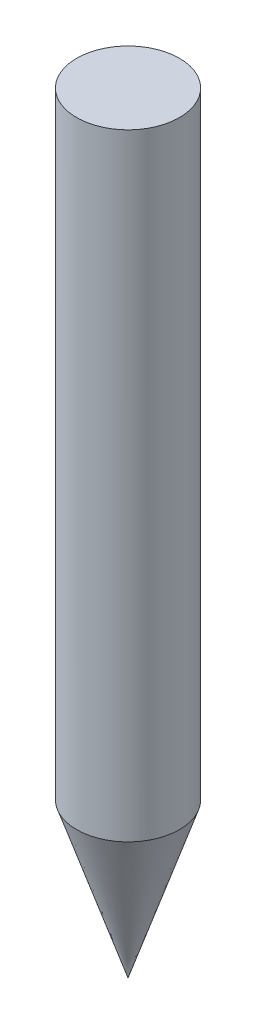
ISO-10303-21;
HEADER;
FILE_DESCRIPTION(('STEP AP214'),'2;1');
FILE_NAME('part.step','',(''),(''),'','','');
FILE_SCHEMA(('AUTOMOTIVE_DESIGN { 1 0 10303 214 1 1 1 1 }'));
ENDSEC;
DATA;
#1=APPLICATION_CONTEXT('core data for automotive mechanical design processes');
#2=APPLICATION_PROTOCOL_DEFINITION('international standard','automotive_design',2000,#1);
#3=PRODUCT_CONTEXT('',#1,'mechanical');
#4=PRODUCT('Part','Part','',(#3));
#5=PRODUCT_RELATED_PRODUCT_CATEGORY('part','',(#4));
#6=PRODUCT_DEFINITION_FORMATION('','',#4);
#7=PRODUCT_DEFINITION_CONTEXT('part definition',#1,'design');
#8=PRODUCT_DEFINITION('design','',#6,#7);
#9=PRODUCT_DEFINITION_SHAPE('','',#8);
#10=(LENGTH_UNIT() NAMED_UNIT(*) SI_UNIT(.MILLI.,.METRE.));
#11=(NAMED_UNIT(*) PLANE_ANGLE_UNIT() SI_UNIT($,.RADIAN.));
#12=(NAMED_UNIT(*) SI_UNIT($,.STERADIAN.) SOLID_ANGLE_UNIT());
#13=UNCERTAINTY_MEASURE_WITH_UNIT(LENGTH_MEASURE(1.E-05),#10,'distance_accuracy_value','');
#14=(GEOMETRIC_REPRESENTATION_CONTEXT(3) GLOBAL_UNCERTAINTY_ASSIGNED_CONTEXT((#13)) GLOBAL_UNIT_ASSIGNED_CONTEXT((#10,
#11,#12)) REPRESENTATION_CONTEXT('',''));
#15=CARTESIAN_POINT('',(0.,0.,0.));
#16=DIRECTION('',(0.,0.,1.));
#17=DIRECTION('',(1.,0.,0.));
#18=AXIS2_PLACEMENT_3D('',#15,#16,#17);
#19=CARTESIAN_POINT('',(4.,60.,0.));
#20=DIRECTION('',(0.,1.,0.));
#21=DIRECTION('',(0.,0.,1.));
#22=AXIS2_PLACEMENT_3D('',#19,#20,#21);
#23=PLANE('',#22);
#24=CARTESIAN_POINT('',(0.,60.,0.));
#25=DIRECTION('',(0.,-1.,0.));
#26=DIRECTION('',(0.,0.,-1.));
#27=AXIS2_PLACEMENT_3D('',#24,#25,#26);
#28=CIRCLE('',#27,4.);
#29=CARTESIAN_POINT('',(0.,60.,-4.));
#30=VERTEX_POINT('',#29);
#31=EDGE_CURVE('E11',#30,#30,#28,.T.);
#32=ORIENTED_EDGE('',*,*,#31,.F.);
#33=EDGE_LOOP('',(#32));
#34=FACE_BOUND('',#33,.T.);
#35=ADVANCED_FACE('F39',(#34),#23,.T.);
#36=CARTESIAN_POINT('',(0.,0.,0.));
#37=DIRECTION('',(0.,-1.,0.));
#38=DIRECTION('',(0.,0.,-1.));
#39=AXIS2_PLACEMENT_3D('',#36,#37,#38);
#40=CYLINDRICAL_SURFACE('',#39,4.);
#41=ORIENTED_EDGE('',*,*,#31,.T.);
#42=EDGE_LOOP('',(#41));
#43=FACE_BOUND('',#42,.T.);
#44=CARTESIAN_POINT('',(0.,12.,0.));
#45=DIRECTION('',(0.,-1.,0.));
#46=DIRECTION('',(0.,0.,-1.));
#47=AXIS2_PLACEMENT_3D('',#44,#45,#46);
#48=CIRCLE('',#47,4.);
#49=CARTESIAN_POINT('',(0.,12.,-4.));
#50=VERTEX_POINT('',#49);
#51=EDGE_CURVE('E44',#50,#50,#48,.T.);
#52=ORIENTED_EDGE('',*,*,#51,.F.);
#53=EDGE_LOOP('',(#52));
#54=FACE_BOUND('',#53,.T.);
#55=ADVANCED_FACE('F49',(#43,#54),#40,.T.);
#56=CARTESIAN_POINT('',(0.,0.,0.));
#57=DIRECTION('',(0.,1.,0.));
#58=DIRECTION('',(0.,0.,1.));
#59=AXIS2_PLACEMENT_3D('',#56,#57,#58);
#60=CONICAL_SURFACE('',#59,0.,0.321750554396642);
#61=ORIENTED_EDGE('',*,*,#51,.T.);
#62=EDGE_LOOP('',(#61));
#63=FACE_BOUND('',#62,.T.);
#64=CARTESIAN_POINT('',(0.,0.,0.));
#65=VERTEX_POINT('',#64);
#66=VERTEX_LOOP('',#65);
#67=FACE_BOUND('',#66,.T.);
#68=ADVANCED_FACE('F48',(#63,#67),#60,.T.);
#69=CLOSED_SHELL('',(#35,#55,#68));
#70=MANIFOLD_SOLID_BREP('B2',#69);
#71=ADVANCED_BREP_SHAPE_REPRESENTATION('',(#18,#70),#14);
#72=SHAPE_DEFINITION_REPRESENTATION(#9,#71);
ENDSEC;
END-ISO-10303-21;
